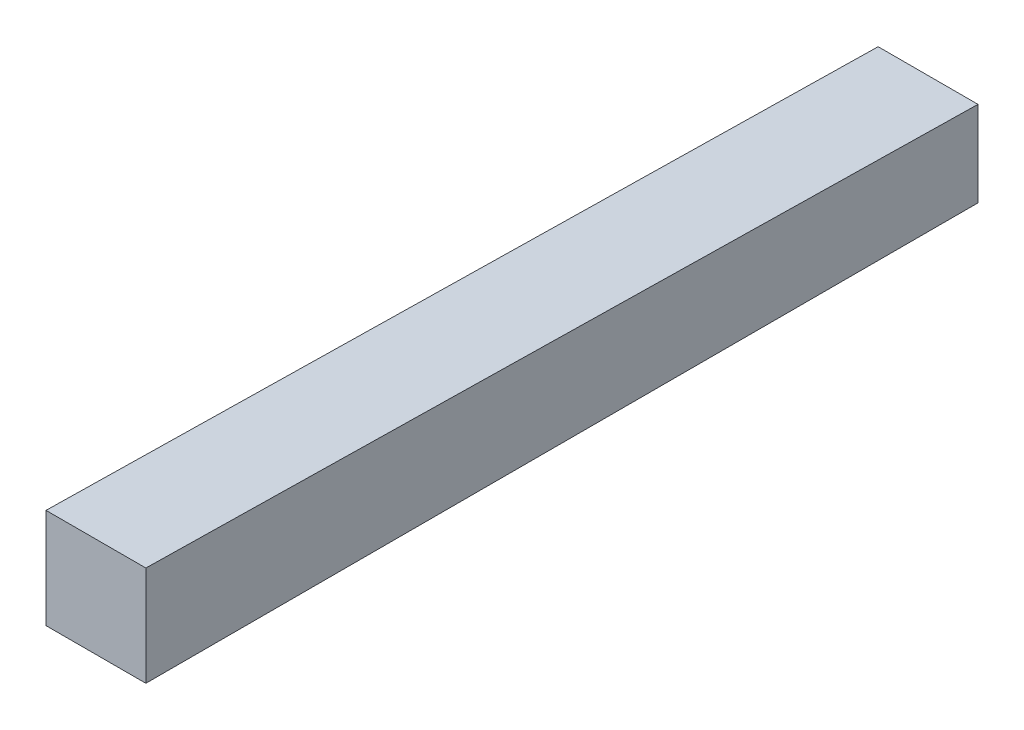
ISO-10303-21;
HEADER;
FILE_DESCRIPTION(('STEP AP214'),'2;1');
FILE_NAME('part.step','',(''),(''),'','','');
FILE_SCHEMA(('AUTOMOTIVE_DESIGN { 1 0 10303 214 1 1 1 1 }'));
ENDSEC;
DATA;
#1=APPLICATION_CONTEXT('core data for automotive mechanical design processes');
#2=APPLICATION_PROTOCOL_DEFINITION('international standard','automotive_design',2000,#1);
#3=PRODUCT_CONTEXT('',#1,'mechanical');
#4=PRODUCT('Part','Part','',(#3));
#5=PRODUCT_RELATED_PRODUCT_CATEGORY('part','',(#4));
#6=PRODUCT_DEFINITION_FORMATION('','',#4);
#7=PRODUCT_DEFINITION_CONTEXT('part definition',#1,'design');
#8=PRODUCT_DEFINITION('design','',#6,#7);
#9=PRODUCT_DEFINITION_SHAPE('','',#8);
#10=(LENGTH_UNIT() NAMED_UNIT(*) SI_UNIT(.MILLI.,.METRE.));
#11=(NAMED_UNIT(*) PLANE_ANGLE_UNIT() SI_UNIT($,.RADIAN.));
#12=(NAMED_UNIT(*) SI_UNIT($,.STERADIAN.) SOLID_ANGLE_UNIT());
#13=UNCERTAINTY_MEASURE_WITH_UNIT(LENGTH_MEASURE(1.E-05),#10,'distance_accuracy_value','');
#14=(GEOMETRIC_REPRESENTATION_CONTEXT(3) GLOBAL_UNCERTAINTY_ASSIGNED_CONTEXT((#13)) GLOBAL_UNIT_ASSIGNED_CONTEXT((#10,
#11,#12)) REPRESENTATION_CONTEXT('',''));
#15=CARTESIAN_POINT('',(0.,0.,0.));
#16=DIRECTION('',(0.,0.,1.));
#17=DIRECTION('',(1.,0.,0.));
#18=AXIS2_PLACEMENT_3D('',#15,#16,#17);
#19=CARTESIAN_POINT('',(3.,-3.,25.));
#20=DIRECTION('',(-1.,0.,0.));
#21=DIRECTION('',(0.,0.,1.));
#22=AXIS2_PLACEMENT_3D('',#19,#20,#21);
#23=PLANE('',#22);
#24=DIRECTION('',(0.,1.,0.));
#25=VECTOR('',#24,1.);
#26=CARTESIAN_POINT('',(3.,-3.,-25.));
#27=LINE('',#26,#25);
#28=CARTESIAN_POINT('',(3.,-3.,-25.));
#29=VERTEX_POINT('',#28);
#30=CARTESIAN_POINT('',(3.,2.12724675358912,-25.));
#31=VERTEX_POINT('',#30);
#32=EDGE_CURVE('E83',#29,#31,#27,.T.);
#33=ORIENTED_EDGE('',*,*,#32,.T.);
#34=DIRECTION('',(0.,0.0174524064372835,0.999847695156391));
#35=VECTOR('',#34,1.);
#36=CARTESIAN_POINT('',(3.,3.,25.));
#37=LINE('',#36,#35);
#38=CARTESIAN_POINT('',(3.,3.,25.));
#39=VERTEX_POINT('',#38);
#40=EDGE_CURVE('E11',#39,#31,#37,.F.);
#41=ORIENTED_EDGE('',*,*,#40,.F.);
#42=DIRECTION('',(0.,1.,0.));
#43=VECTOR('',#42,1.);
#44=CARTESIAN_POINT('',(3.,-3.,25.));
#45=LINE('',#44,#43);
#46=CARTESIAN_POINT('',(3.,-3.,25.));
#47=VERTEX_POINT('',#46);
#48=EDGE_CURVE('E95',#47,#39,#45,.T.);
#49=ORIENTED_EDGE('',*,*,#48,.F.);
#50=DIRECTION('',(0.,0.,-1.));
#51=VECTOR('',#50,1.);
#52=CARTESIAN_POINT('',(3.,-3.,25.));
#53=LINE('',#52,#51);
#54=EDGE_CURVE('E100',#47,#29,#53,.T.);
#55=ORIENTED_EDGE('',*,*,#54,.T.);
#56=EDGE_LOOP('',(#33,#41,#49,#55));
#57=FACE_BOUND('',#56,.T.);
#58=ADVANCED_FACE('F39',(#57),#23,.F.);
#59=CARTESIAN_POINT('',(-3.,3.,25.));
#60=DIRECTION('',(0.,0.999847695156391,-0.0174524064372835));
#61=DIRECTION('',(0.,0.0174524064372835,0.999847695156391));
#62=AXIS2_PLACEMENT_3D('',#59,#60,#61);
#63=PLANE('',#62);
#64=DIRECTION('',(1.,0.,0.));
#65=VECTOR('',#64,1.);
#66=CARTESIAN_POINT('',(0.,2.12724675358912,-25.));
#67=LINE('',#66,#65);
#68=CARTESIAN_POINT('',(-3.,2.12724675358912,-25.));
#69=VERTEX_POINT('',#68);
#70=EDGE_CURVE('E74',#31,#69,#67,.F.);
#71=ORIENTED_EDGE('',*,*,#70,.T.);
#72=DIRECTION('',(0.,0.0174524064372835,0.999847695156391));
#73=VECTOR('',#72,1.);
#74=CARTESIAN_POINT('',(-3.,2.99817248105729,24.8953015098925));
#75=LINE('',#74,#73);
#76=CARTESIAN_POINT('',(-3.,3.,25.));
#77=VERTEX_POINT('',#76);
#78=EDGE_CURVE('E43',#77,#69,#75,.F.);
#79=ORIENTED_EDGE('',*,*,#78,.F.);
#80=DIRECTION('',(-1.,0.,0.));
#81=VECTOR('',#80,1.);
#82=CARTESIAN_POINT('',(-3.,3.,25.));
#83=LINE('',#82,#81);
#84=EDGE_CURVE('E106',#39,#77,#83,.T.);
#85=ORIENTED_EDGE('',*,*,#84,.F.);
#86=ORIENTED_EDGE('',*,*,#40,.T.);
#87=EDGE_LOOP('',(#71,#79,#85,#86));
#88=FACE_BOUND('',#87,.T.);
#89=ADVANCED_FACE('F41',(#88),#63,.T.);
#90=CARTESIAN_POINT('',(-3.,-3.,25.));
#91=DIRECTION('',(1.,0.,0.));
#92=DIRECTION('',(0.,0.,-1.));
#93=AXIS2_PLACEMENT_3D('',#90,#91,#92);
#94=PLANE('',#93);
#95=DIRECTION('',(0.,-1.,0.));
#96=VECTOR('',#95,1.);
#97=CARTESIAN_POINT('',(-3.,-3.,-25.));
#98=LINE('',#97,#96);
#99=CARTESIAN_POINT('',(-3.,-3.,-25.));
#100=VERTEX_POINT('',#99);
#101=EDGE_CURVE('E82',#69,#100,#98,.T.);
#102=ORIENTED_EDGE('',*,*,#101,.T.);
#103=DIRECTION('',(0.,0.,-1.));
#104=VECTOR('',#103,1.);
#105=CARTESIAN_POINT('',(-3.,-3.,25.));
#106=LINE('',#105,#104);
#107=CARTESIAN_POINT('',(-3.,-3.,25.));
#108=VERTEX_POINT('',#107);
#109=EDGE_CURVE('E90',#108,#100,#106,.T.);
#110=ORIENTED_EDGE('',*,*,#109,.F.);
#111=DIRECTION('',(0.,-1.,0.));
#112=VECTOR('',#111,1.);
#113=CARTESIAN_POINT('',(-3.,-3.,25.));
#114=LINE('',#113,#112);
#115=EDGE_CURVE('E89',#77,#108,#114,.T.);
#116=ORIENTED_EDGE('',*,*,#115,.F.);
#117=ORIENTED_EDGE('',*,*,#78,.T.);
#118=EDGE_LOOP('',(#102,#110,#116,#117));
#119=FACE_BOUND('',#118,.T.);
#120=ADVANCED_FACE('F86',(#119),#94,.F.);
#121=CARTESIAN_POINT('',(-3.,-3.,25.));
#122=DIRECTION('',(0.,1.,0.));
#123=DIRECTION('',(0.,0.,1.));
#124=AXIS2_PLACEMENT_3D('',#121,#122,#123);
#125=PLANE('',#124);
#126=DIRECTION('',(1.,0.,0.));
#127=VECTOR('',#126,1.);
#128=CARTESIAN_POINT('',(-3.,-3.,-25.));
#129=LINE('',#128,#127);
#130=EDGE_CURVE('E93',#100,#29,#129,.T.);
#131=ORIENTED_EDGE('',*,*,#130,.T.);
#132=ORIENTED_EDGE('',*,*,#54,.F.);
#133=DIRECTION('',(1.,0.,0.));
#134=VECTOR('',#133,1.);
#135=CARTESIAN_POINT('',(-3.,-3.,25.));
#136=LINE('',#135,#134);
#137=EDGE_CURVE('E56',#108,#47,#136,.T.);
#138=ORIENTED_EDGE('',*,*,#137,.F.);
#139=ORIENTED_EDGE('',*,*,#109,.T.);
#140=EDGE_LOOP('',(#131,#132,#138,#139));
#141=FACE_BOUND('',#140,.T.);
#142=ADVANCED_FACE('F104',(#141),#125,.F.);
#143=CARTESIAN_POINT('',(0.,0.,25.));
#144=DIRECTION('',(0.,0.,-1.));
#145=DIRECTION('',(-1.,0.,0.));
#146=AXIS2_PLACEMENT_3D('',#143,#144,#145);
#147=PLANE('',#146);
#148=ORIENTED_EDGE('',*,*,#48,.T.);
#149=ORIENTED_EDGE('',*,*,#84,.T.);
#150=ORIENTED_EDGE('',*,*,#115,.T.);
#151=ORIENTED_EDGE('',*,*,#137,.T.);
#152=EDGE_LOOP('',(#148,#149,#150,#151));
#153=FACE_BOUND('',#152,.T.);
#154=ADVANCED_FACE('F111',(#153),#147,.F.);
#155=CARTESIAN_POINT('',(0.,0.,-25.));
#156=DIRECTION('',(0.,0.,-1.));
#157=DIRECTION('',(-1.,0.,0.));
#158=AXIS2_PLACEMENT_3D('',#155,#156,#157);
#159=PLANE('',#158);
#160=ORIENTED_EDGE('',*,*,#32,.F.);
#161=ORIENTED_EDGE('',*,*,#130,.F.);
#162=ORIENTED_EDGE('',*,*,#101,.F.);
#163=ORIENTED_EDGE('',*,*,#70,.F.);
#164=EDGE_LOOP('',(#160,#161,#162,#163));
#165=FACE_BOUND('',#164,.T.);
#166=ADVANCED_FACE('F92',(#165),#159,.T.);
#167=CLOSED_SHELL('',(#58,#89,#120,#142,#154,#166));
#168=MANIFOLD_SOLID_BREP('B2',#167);
#169=ADVANCED_BREP_SHAPE_REPRESENTATION('',(#18,#168),#14);
#170=SHAPE_DEFINITION_REPRESENTATION(#9,#169);
ENDSEC;
END-ISO-10303-21;
